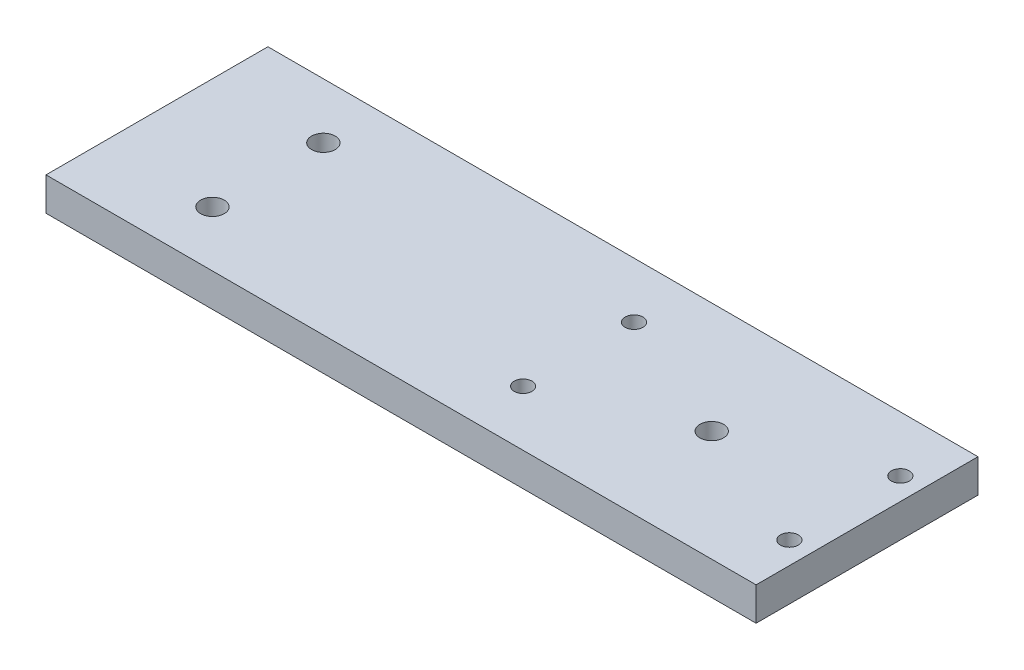
ISO-10303-21;
HEADER;
FILE_DESCRIPTION(('STEP AP214'),'2;1');
FILE_NAME('part.step','',(''),(''),'','','');
FILE_SCHEMA(('AUTOMOTIVE_DESIGN { 1 0 10303 214 1 1 1 1 }'));
ENDSEC;
DATA;
#1=APPLICATION_CONTEXT('core data for automotive mechanical design processes');
#2=APPLICATION_PROTOCOL_DEFINITION('international standard','automotive_design',2000,#1);
#3=PRODUCT_CONTEXT('',#1,'mechanical');
#4=PRODUCT('Part','Part','',(#3));
#5=PRODUCT_RELATED_PRODUCT_CATEGORY('part','',(#4));
#6=PRODUCT_DEFINITION_FORMATION('','',#4);
#7=PRODUCT_DEFINITION_CONTEXT('part definition',#1,'design');
#8=PRODUCT_DEFINITION('design','',#6,#7);
#9=PRODUCT_DEFINITION_SHAPE('','',#8);
#10=(LENGTH_UNIT() NAMED_UNIT(*) SI_UNIT(.MILLI.,.METRE.));
#11=(NAMED_UNIT(*) PLANE_ANGLE_UNIT() SI_UNIT($,.RADIAN.));
#12=(NAMED_UNIT(*) SI_UNIT($,.STERADIAN.) SOLID_ANGLE_UNIT());
#13=UNCERTAINTY_MEASURE_WITH_UNIT(LENGTH_MEASURE(1.E-05),#10,'distance_accuracy_value','');
#14=(GEOMETRIC_REPRESENTATION_CONTEXT(3) GLOBAL_UNCERTAINTY_ASSIGNED_CONTEXT((#13)) GLOBAL_UNIT_ASSIGNED_CONTEXT((#10,
#11,#12)) REPRESENTATION_CONTEXT('',''));
#15=CARTESIAN_POINT('',(0.,0.,0.));
#16=DIRECTION('',(0.,0.,1.));
#17=DIRECTION('',(1.,0.,0.));
#18=AXIS2_PLACEMENT_3D('',#15,#16,#17);
#19=CARTESIAN_POINT('',(-101.6,9.525,31.75));
#20=DIRECTION('',(-1.,0.,0.));
#21=DIRECTION('',(0.,0.,1.));
#22=AXIS2_PLACEMENT_3D('',#19,#20,#21);
#23=PLANE('',#22);
#24=DIRECTION('',(0.,0.,-1.));
#25=VECTOR('',#24,1.);
#26=CARTESIAN_POINT('',(-101.6,0.,31.75));
#27=LINE('',#26,#25);
#28=CARTESIAN_POINT('',(-101.6,0.,31.75));
#29=VERTEX_POINT('',#28);
#30=CARTESIAN_POINT('',(-101.6,0.,-31.75));
#31=VERTEX_POINT('',#30);
#32=EDGE_CURVE('E110',#29,#31,#27,.T.);
#33=ORIENTED_EDGE('',*,*,#32,.F.);
#34=DIRECTION('',(0.,-1.,0.));
#35=VECTOR('',#34,1.);
#36=CARTESIAN_POINT('',(-101.6,9.525,31.75));
#37=LINE('',#36,#35);
#38=CARTESIAN_POINT('',(-101.6,9.525,31.75));
#39=VERTEX_POINT('',#38);
#40=EDGE_CURVE('E11',#39,#29,#37,.T.);
#41=ORIENTED_EDGE('',*,*,#40,.F.);
#42=DIRECTION('',(0.,0.,-1.));
#43=VECTOR('',#42,1.);
#44=CARTESIAN_POINT('',(-101.6,9.525,31.75));
#45=LINE('',#44,#43);
#46=CARTESIAN_POINT('',(-101.6,9.525,-31.75));
#47=VERTEX_POINT('',#46);
#48=EDGE_CURVE('E102',#39,#47,#45,.T.);
#49=ORIENTED_EDGE('',*,*,#48,.T.);
#50=DIRECTION('',(0.,-1.,0.));
#51=VECTOR('',#50,1.);
#52=CARTESIAN_POINT('',(-101.6,9.525,-31.75));
#53=LINE('',#52,#51);
#54=EDGE_CURVE('E41',#47,#31,#53,.T.);
#55=ORIENTED_EDGE('',*,*,#54,.T.);
#56=EDGE_LOOP('',(#33,#41,#49,#55));
#57=FACE_BOUND('',#56,.T.);
#58=ADVANCED_FACE('F38',(#57),#23,.T.);
#59=CARTESIAN_POINT('',(-101.6,9.525,31.75));
#60=DIRECTION('',(0.,0.,-1.));
#61=DIRECTION('',(-1.,0.,0.));
#62=AXIS2_PLACEMENT_3D('',#59,#60,#61);
#63=PLANE('',#62);
#64=DIRECTION('',(1.,0.,0.));
#65=VECTOR('',#64,1.);
#66=CARTESIAN_POINT('',(-101.6,0.,31.75));
#67=LINE('',#66,#65);
#68=CARTESIAN_POINT('',(101.6,0.,31.75));
#69=VERTEX_POINT('',#68);
#70=EDGE_CURVE('E72',#29,#69,#67,.T.);
#71=ORIENTED_EDGE('',*,*,#70,.T.);
#72=DIRECTION('',(0.,-1.,0.));
#73=VECTOR('',#72,1.);
#74=CARTESIAN_POINT('',(101.6,9.525,31.75));
#75=LINE('',#74,#73);
#76=CARTESIAN_POINT('',(101.6,9.525,31.75));
#77=VERTEX_POINT('',#76);
#78=EDGE_CURVE('E48',#77,#69,#75,.T.);
#79=ORIENTED_EDGE('',*,*,#78,.F.);
#80=DIRECTION('',(1.,0.,0.));
#81=VECTOR('',#80,1.);
#82=CARTESIAN_POINT('',(-101.6,9.525,31.75));
#83=LINE('',#82,#81);
#84=EDGE_CURVE('E89',#39,#77,#83,.T.);
#85=ORIENTED_EDGE('',*,*,#84,.F.);
#86=ORIENTED_EDGE('',*,*,#40,.T.);
#87=EDGE_LOOP('',(#71,#79,#85,#86));
#88=FACE_BOUND('',#87,.T.);
#89=ADVANCED_FACE('F127',(#88),#63,.F.);
#90=CARTESIAN_POINT('',(101.6,9.525,31.75));
#91=DIRECTION('',(-1.,0.,0.));
#92=DIRECTION('',(0.,0.,1.));
#93=AXIS2_PLACEMENT_3D('',#90,#91,#92);
#94=PLANE('',#93);
#95=DIRECTION('',(0.,0.,-1.));
#96=VECTOR('',#95,1.);
#97=CARTESIAN_POINT('',(101.6,0.,31.75));
#98=LINE('',#97,#96);
#99=CARTESIAN_POINT('',(101.6,0.,-31.75));
#100=VERTEX_POINT('',#99);
#101=EDGE_CURVE('E97',#69,#100,#98,.T.);
#102=ORIENTED_EDGE('',*,*,#101,.T.);
#103=DIRECTION('',(0.,-1.,0.));
#104=VECTOR('',#103,1.);
#105=CARTESIAN_POINT('',(101.6,9.525,-31.75));
#106=LINE('',#105,#104);
#107=CARTESIAN_POINT('',(101.6,9.525,-31.75));
#108=VERTEX_POINT('',#107);
#109=EDGE_CURVE('E94',#108,#100,#106,.T.);
#110=ORIENTED_EDGE('',*,*,#109,.F.);
#111=DIRECTION('',(0.,0.,-1.));
#112=VECTOR('',#111,1.);
#113=CARTESIAN_POINT('',(101.6,9.525,31.75));
#114=LINE('',#113,#112);
#115=EDGE_CURVE('E84',#77,#108,#114,.T.);
#116=ORIENTED_EDGE('',*,*,#115,.F.);
#117=ORIENTED_EDGE('',*,*,#78,.T.);
#118=EDGE_LOOP('',(#102,#110,#116,#117));
#119=FACE_BOUND('',#118,.T.);
#120=ADVANCED_FACE('F95',(#119),#94,.F.);
#121=CARTESIAN_POINT('',(-101.6,9.525,-31.75));
#122=DIRECTION('',(0.,0.,-1.));
#123=DIRECTION('',(-1.,0.,0.));
#124=AXIS2_PLACEMENT_3D('',#121,#122,#123);
#125=PLANE('',#124);
#126=DIRECTION('',(1.,0.,0.));
#127=VECTOR('',#126,1.);
#128=CARTESIAN_POINT('',(-101.6,0.,-31.75));
#129=LINE('',#128,#127);
#130=EDGE_CURVE('E114',#31,#100,#129,.T.);
#131=ORIENTED_EDGE('',*,*,#130,.F.);
#132=ORIENTED_EDGE('',*,*,#54,.F.);
#133=DIRECTION('',(1.,0.,0.));
#134=VECTOR('',#133,1.);
#135=CARTESIAN_POINT('',(-101.6,9.525,-31.75));
#136=LINE('',#135,#134);
#137=EDGE_CURVE('E88',#47,#108,#136,.T.);
#138=ORIENTED_EDGE('',*,*,#137,.T.);
#139=ORIENTED_EDGE('',*,*,#109,.T.);
#140=EDGE_LOOP('',(#131,#132,#138,#139));
#141=FACE_BOUND('',#140,.T.);
#142=ADVANCED_FACE('F100',(#141),#125,.T.);
#143=CARTESIAN_POINT('',(0.,9.525,0.));
#144=DIRECTION('',(0.,-1.,0.));
#145=DIRECTION('',(0.,0.,-1.));
#146=AXIS2_PLACEMENT_3D('',#143,#144,#145);
#147=PLANE('',#146);
#148=CARTESIAN_POINT('',(-69.85,9.525,-15.8749999999999));
#149=DIRECTION('',(0.,-1.,0.));
#150=DIRECTION('',(0.,0.,-1.));
#151=AXIS2_PLACEMENT_3D('',#148,#149,#150);
#152=CIRCLE('',#151,3.3782);
#153=CARTESIAN_POINT('',(-69.85,9.525,-19.2531999999999));
#154=VERTEX_POINT('',#153);
#155=EDGE_CURVE('E182',#154,#154,#152,.T.);
#156=ORIENTED_EDGE('',*,*,#155,.T.);
#157=EDGE_LOOP('',(#156));
#158=FACE_BOUND('',#157,.T.);
#159=CARTESIAN_POINT('',(-69.85,9.525,15.8750000000001));
#160=DIRECTION('',(0.,-1.,0.));
#161=DIRECTION('',(0.,0.,-1.));
#162=AXIS2_PLACEMENT_3D('',#159,#160,#161);
#163=CIRCLE('',#162,3.3782);
#164=CARTESIAN_POINT('',(-69.85,9.525,12.4968000000001));
#165=VERTEX_POINT('',#164);
#166=EDGE_CURVE('E195',#165,#165,#163,.T.);
#167=ORIENTED_EDGE('',*,*,#166,.T.);
#168=EDGE_LOOP('',(#167));
#169=FACE_BOUND('',#168,.T.);
#170=CARTESIAN_POINT('',(57.15,9.525,1.11022302462516E-13));
#171=DIRECTION('',(0.,-1.,0.));
#172=DIRECTION('',(0.,0.,-1.));
#173=AXIS2_PLACEMENT_3D('',#170,#171,#172);
#174=CIRCLE('',#173,3.3782);
#175=CARTESIAN_POINT('',(57.15,9.525,-3.37819999999989));
#176=VERTEX_POINT('',#175);
#177=EDGE_CURVE('E203',#176,#176,#174,.T.);
#178=ORIENTED_EDGE('',*,*,#177,.T.);
#179=EDGE_LOOP('',(#178));
#180=FACE_BOUND('',#179,.T.);
#181=CARTESIAN_POINT('',(19.05,9.525,-15.8749999999999));
#182=DIRECTION('',(0.,-1.,0.));
#183=DIRECTION('',(0.,0.,-1.));
#184=AXIS2_PLACEMENT_3D('',#181,#182,#183);
#185=CIRCLE('',#184,2.5527);
#186=CARTESIAN_POINT('',(19.05,9.525,-18.4276999999999));
#187=VERTEX_POINT('',#186);
#188=EDGE_CURVE('E211',#187,#187,#185,.T.);
#189=ORIENTED_EDGE('',*,*,#188,.T.);
#190=EDGE_LOOP('',(#189));
#191=FACE_BOUND('',#190,.T.);
#192=CARTESIAN_POINT('',(95.25,9.525,-15.8749999999999));
#193=DIRECTION('',(0.,-1.,0.));
#194=DIRECTION('',(0.,0.,-1.));
#195=AXIS2_PLACEMENT_3D('',#192,#193,#194);
#196=CIRCLE('',#195,2.55270000000001);
#197=CARTESIAN_POINT('',(95.25,9.525,-18.4276999999999));
#198=VERTEX_POINT('',#197);
#199=EDGE_CURVE('E219',#198,#198,#196,.T.);
#200=ORIENTED_EDGE('',*,*,#199,.T.);
#201=EDGE_LOOP('',(#200));
#202=FACE_BOUND('',#201,.T.);
#203=CARTESIAN_POINT('',(95.25,9.525,15.8750000000001));
#204=DIRECTION('',(0.,-1.,0.));
#205=DIRECTION('',(0.,0.,-1.));
#206=AXIS2_PLACEMENT_3D('',#203,#204,#205);
#207=CIRCLE('',#206,2.55270000000001);
#208=CARTESIAN_POINT('',(95.25,9.525,13.3223000000001));
#209=VERTEX_POINT('',#208);
#210=EDGE_CURVE('E227',#209,#209,#207,.T.);
#211=ORIENTED_EDGE('',*,*,#210,.T.);
#212=EDGE_LOOP('',(#211));
#213=FACE_BOUND('',#212,.T.);
#214=CARTESIAN_POINT('',(19.05,9.525,15.8750000000001));
#215=DIRECTION('',(0.,-1.,0.));
#216=DIRECTION('',(0.,0.,-1.));
#217=AXIS2_PLACEMENT_3D('',#214,#215,#216);
#218=CIRCLE('',#217,2.5527);
#219=CARTESIAN_POINT('',(19.05,9.525,13.3223000000001));
#220=VERTEX_POINT('',#219);
#221=EDGE_CURVE('E115',#220,#220,#218,.T.);
#222=ORIENTED_EDGE('',*,*,#221,.T.);
#223=EDGE_LOOP('',(#222));
#224=FACE_BOUND('',#223,.T.);
#225=ORIENTED_EDGE('',*,*,#48,.F.);
#226=ORIENTED_EDGE('',*,*,#84,.T.);
#227=ORIENTED_EDGE('',*,*,#115,.T.);
#228=ORIENTED_EDGE('',*,*,#137,.F.);
#229=EDGE_LOOP('',(#225,#226,#227,#228));
#230=FACE_BOUND('',#229,.T.);
#231=ADVANCED_FACE('F87',(#158,#169,#180,#191,#202,#213,#224,#230),#147,.F.);
#232=CARTESIAN_POINT('',(0.,0.,0.));
#233=DIRECTION('',(0.,-1.,0.));
#234=DIRECTION('',(0.,0.,-1.));
#235=AXIS2_PLACEMENT_3D('',#232,#233,#234);
#236=PLANE('',#235);
#237=CARTESIAN_POINT('',(-69.85,0.,-15.8749999999999));
#238=DIRECTION('',(0.,-1.,0.));
#239=DIRECTION('',(0.,0.,-1.));
#240=AXIS2_PLACEMENT_3D('',#237,#238,#239);
#241=CIRCLE('',#240,3.37819999999998);
#242=CARTESIAN_POINT('',(-69.85,0.,-19.2531999999999));
#243=VERTEX_POINT('',#242);
#244=EDGE_CURVE('E185',#243,#243,#241,.T.);
#245=ORIENTED_EDGE('',*,*,#244,.F.);
#246=EDGE_LOOP('',(#245));
#247=FACE_BOUND('',#246,.T.);
#248=CARTESIAN_POINT('',(-69.85,0.,15.8750000000001));
#249=DIRECTION('',(0.,-1.,0.));
#250=DIRECTION('',(0.,0.,-1.));
#251=AXIS2_PLACEMENT_3D('',#248,#249,#250);
#252=CIRCLE('',#251,3.37819999999998);
#253=CARTESIAN_POINT('',(-69.85,0.,12.4968000000001));
#254=VERTEX_POINT('',#253);
#255=EDGE_CURVE('E189',#254,#254,#252,.T.);
#256=ORIENTED_EDGE('',*,*,#255,.F.);
#257=EDGE_LOOP('',(#256));
#258=FACE_BOUND('',#257,.T.);
#259=CARTESIAN_POINT('',(57.15,0.,1.11022302462516E-13));
#260=DIRECTION('',(0.,-1.,0.));
#261=DIRECTION('',(0.,0.,-1.));
#262=AXIS2_PLACEMENT_3D('',#259,#260,#261);
#263=CIRCLE('',#262,3.3782);
#264=CARTESIAN_POINT('',(57.15,0.,-3.37819999999989));
#265=VERTEX_POINT('',#264);
#266=EDGE_CURVE('E199',#265,#265,#263,.T.);
#267=ORIENTED_EDGE('',*,*,#266,.F.);
#268=EDGE_LOOP('',(#267));
#269=FACE_BOUND('',#268,.T.);
#270=CARTESIAN_POINT('',(19.05,0.,-15.8749999999999));
#271=DIRECTION('',(0.,-1.,0.));
#272=DIRECTION('',(0.,0.,-1.));
#273=AXIS2_PLACEMENT_3D('',#270,#271,#272);
#274=CIRCLE('',#273,2.5527);
#275=CARTESIAN_POINT('',(19.05,0.,-18.4276999999999));
#276=VERTEX_POINT('',#275);
#277=EDGE_CURVE('E207',#276,#276,#274,.T.);
#278=ORIENTED_EDGE('',*,*,#277,.F.);
#279=EDGE_LOOP('',(#278));
#280=FACE_BOUND('',#279,.T.);
#281=CARTESIAN_POINT('',(95.25,0.,-15.8749999999999));
#282=DIRECTION('',(0.,-1.,0.));
#283=DIRECTION('',(0.,0.,-1.));
#284=AXIS2_PLACEMENT_3D('',#281,#282,#283);
#285=CIRCLE('',#284,2.55270000000001);
#286=CARTESIAN_POINT('',(95.25,0.,-18.4276999999999));
#287=VERTEX_POINT('',#286);
#288=EDGE_CURVE('E215',#287,#287,#285,.T.);
#289=ORIENTED_EDGE('',*,*,#288,.F.);
#290=EDGE_LOOP('',(#289));
#291=FACE_BOUND('',#290,.T.);
#292=CARTESIAN_POINT('',(95.25,0.,15.8750000000001));
#293=DIRECTION('',(0.,-1.,0.));
#294=DIRECTION('',(0.,0.,-1.));
#295=AXIS2_PLACEMENT_3D('',#292,#293,#294);
#296=CIRCLE('',#295,2.55270000000001);
#297=CARTESIAN_POINT('',(95.25,0.,13.3223000000001));
#298=VERTEX_POINT('',#297);
#299=EDGE_CURVE('E223',#298,#298,#296,.T.);
#300=ORIENTED_EDGE('',*,*,#299,.F.);
#301=EDGE_LOOP('',(#300));
#302=FACE_BOUND('',#301,.T.);
#303=CARTESIAN_POINT('',(19.05,0.,15.8750000000001));
#304=DIRECTION('',(0.,-1.,0.));
#305=DIRECTION('',(0.,0.,-1.));
#306=AXIS2_PLACEMENT_3D('',#303,#304,#305);
#307=CIRCLE('',#306,2.5527);
#308=CARTESIAN_POINT('',(19.05,0.,13.3223000000001));
#309=VERTEX_POINT('',#308);
#310=EDGE_CURVE('E231',#309,#309,#307,.T.);
#311=ORIENTED_EDGE('',*,*,#310,.F.);
#312=EDGE_LOOP('',(#311));
#313=FACE_BOUND('',#312,.T.);
#314=ORIENTED_EDGE('',*,*,#32,.T.);
#315=ORIENTED_EDGE('',*,*,#130,.T.);
#316=ORIENTED_EDGE('',*,*,#101,.F.);
#317=ORIENTED_EDGE('',*,*,#70,.F.);
#318=EDGE_LOOP('',(#314,#315,#316,#317));
#319=FACE_BOUND('',#318,.T.);
#320=ADVANCED_FACE('F124',(#247,#258,#269,#280,#291,#302,#313,#319),#236,.T.);
#321=CARTESIAN_POINT('',(19.05,0.,15.8750000000001));
#322=DIRECTION('',(0.,-1.,0.));
#323=DIRECTION('',(0.,0.,-1.));
#324=AXIS2_PLACEMENT_3D('',#321,#322,#323);
#325=CYLINDRICAL_SURFACE('',#324,2.5527);
#326=ORIENTED_EDGE('',*,*,#221,.F.);
#327=EDGE_LOOP('',(#326));
#328=FACE_BOUND('',#327,.T.);
#329=ORIENTED_EDGE('',*,*,#310,.T.);
#330=EDGE_LOOP('',(#329));
#331=FACE_BOUND('',#330,.T.);
#332=ADVANCED_FACE('F147',(#328,#331),#325,.F.);
#333=CARTESIAN_POINT('',(95.25,0.,15.8750000000001));
#334=DIRECTION('',(0.,-1.,0.));
#335=DIRECTION('',(0.,0.,-1.));
#336=AXIS2_PLACEMENT_3D('',#333,#334,#335);
#337=CYLINDRICAL_SURFACE('',#336,2.55270000000001);
#338=ORIENTED_EDGE('',*,*,#210,.F.);
#339=EDGE_LOOP('',(#338));
#340=FACE_BOUND('',#339,.T.);
#341=ORIENTED_EDGE('',*,*,#299,.T.);
#342=EDGE_LOOP('',(#341));
#343=FACE_BOUND('',#342,.T.);
#344=ADVANCED_FACE('F154',(#340,#343),#337,.F.);
#345=CARTESIAN_POINT('',(95.25,0.,-15.8749999999999));
#346=DIRECTION('',(0.,-1.,0.));
#347=DIRECTION('',(0.,0.,-1.));
#348=AXIS2_PLACEMENT_3D('',#345,#346,#347);
#349=CYLINDRICAL_SURFACE('',#348,2.55270000000001);
#350=ORIENTED_EDGE('',*,*,#199,.F.);
#351=EDGE_LOOP('',(#350));
#352=FACE_BOUND('',#351,.T.);
#353=ORIENTED_EDGE('',*,*,#288,.T.);
#354=EDGE_LOOP('',(#353));
#355=FACE_BOUND('',#354,.T.);
#356=ADVANCED_FACE('F158',(#352,#355),#349,.F.);
#357=CARTESIAN_POINT('',(19.05,0.,-15.8749999999999));
#358=DIRECTION('',(0.,-1.,0.));
#359=DIRECTION('',(0.,0.,-1.));
#360=AXIS2_PLACEMENT_3D('',#357,#358,#359);
#361=CYLINDRICAL_SURFACE('',#360,2.5527);
#362=ORIENTED_EDGE('',*,*,#188,.F.);
#363=EDGE_LOOP('',(#362));
#364=FACE_BOUND('',#363,.T.);
#365=ORIENTED_EDGE('',*,*,#277,.T.);
#366=EDGE_LOOP('',(#365));
#367=FACE_BOUND('',#366,.T.);
#368=ADVANCED_FACE('F162',(#364,#367),#361,.F.);
#369=CARTESIAN_POINT('',(57.15,0.,1.11022302462516E-13));
#370=DIRECTION('',(0.,-1.,0.));
#371=DIRECTION('',(0.,0.,-1.));
#372=AXIS2_PLACEMENT_3D('',#369,#370,#371);
#373=CYLINDRICAL_SURFACE('',#372,3.3782);
#374=ORIENTED_EDGE('',*,*,#177,.F.);
#375=EDGE_LOOP('',(#374));
#376=FACE_BOUND('',#375,.T.);
#377=ORIENTED_EDGE('',*,*,#266,.T.);
#378=EDGE_LOOP('',(#377));
#379=FACE_BOUND('',#378,.T.);
#380=ADVANCED_FACE('F166',(#376,#379),#373,.F.);
#381=CARTESIAN_POINT('',(-69.85,0.,15.8750000000001));
#382=DIRECTION('',(0.,-1.,0.));
#383=DIRECTION('',(0.,0.,-1.));
#384=AXIS2_PLACEMENT_3D('',#381,#382,#383);
#385=CYLINDRICAL_SURFACE('',#384,3.37819999999999);
#386=ORIENTED_EDGE('',*,*,#166,.F.);
#387=EDGE_LOOP('',(#386));
#388=FACE_BOUND('',#387,.T.);
#389=ORIENTED_EDGE('',*,*,#255,.T.);
#390=EDGE_LOOP('',(#389));
#391=FACE_BOUND('',#390,.T.);
#392=ADVANCED_FACE('F170',(#388,#391),#385,.F.);
#393=CARTESIAN_POINT('',(-69.85,0.,-15.8749999999999));
#394=DIRECTION('',(0.,-1.,0.));
#395=DIRECTION('',(0.,0.,-1.));
#396=AXIS2_PLACEMENT_3D('',#393,#394,#395);
#397=CYLINDRICAL_SURFACE('',#396,3.37819999999999);
#398=ORIENTED_EDGE('',*,*,#155,.F.);
#399=EDGE_LOOP('',(#398));
#400=FACE_BOUND('',#399,.T.);
#401=ORIENTED_EDGE('',*,*,#244,.T.);
#402=EDGE_LOOP('',(#401));
#403=FACE_BOUND('',#402,.T.);
#404=ADVANCED_FACE('F174',(#400,#403),#397,.F.);
#405=CLOSED_SHELL('',(#58,#89,#120,#142,#231,#320,#332,#344,#356,#368,#380,#392,#404));
#406=MANIFOLD_SOLID_BREP('B2',#405);
#407=ADVANCED_BREP_SHAPE_REPRESENTATION('',(#18,#406),#14);
#408=SHAPE_DEFINITION_REPRESENTATION(#9,#407);
ENDSEC;
END-ISO-10303-21;
